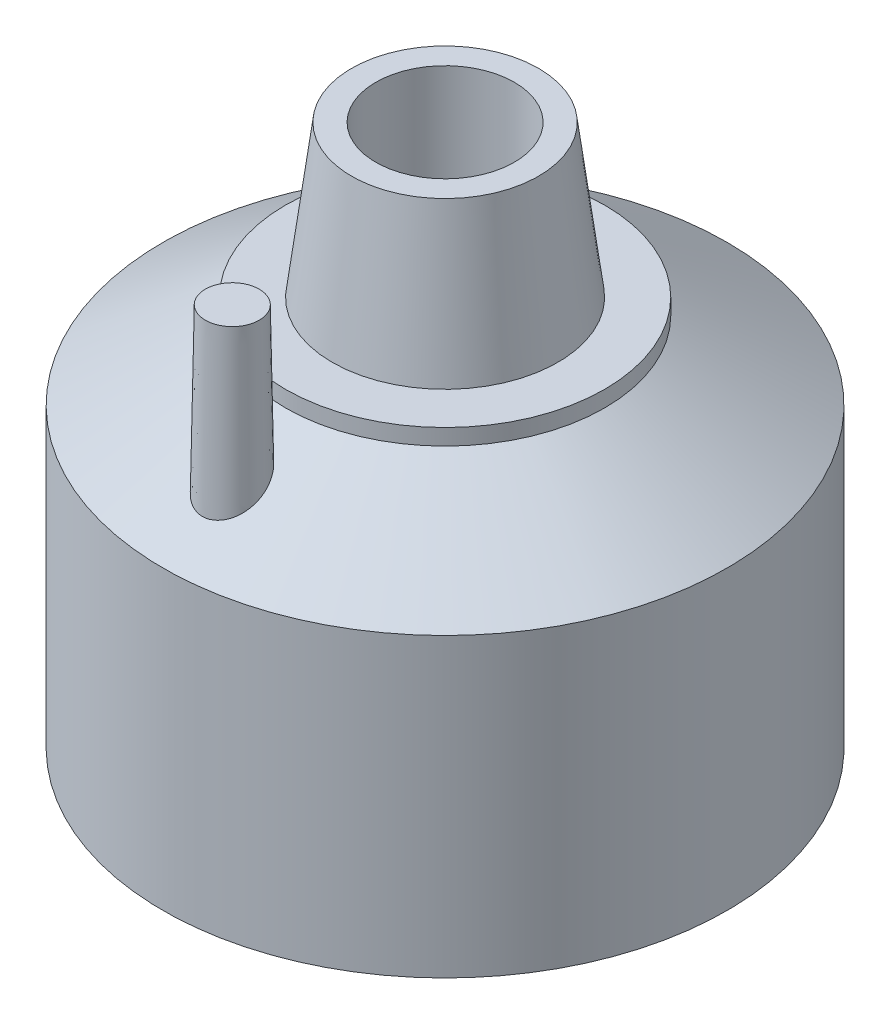
ISO-10303-21;
HEADER;
FILE_DESCRIPTION(('STEP AP214'),'2;1');
FILE_NAME('part.step','',(''),(''),'','','');
FILE_SCHEMA(('AUTOMOTIVE_DESIGN { 1 0 10303 214 1 1 1 1 }'));
ENDSEC;
DATA;
#1=APPLICATION_CONTEXT('core data for automotive mechanical design processes');
#2=APPLICATION_PROTOCOL_DEFINITION('international standard','automotive_design',2000,#1);
#3=PRODUCT_CONTEXT('',#1,'mechanical');
#4=PRODUCT('Part','Part','',(#3));
#5=PRODUCT_RELATED_PRODUCT_CATEGORY('part','',(#4));
#6=PRODUCT_DEFINITION_FORMATION('','',#4);
#7=PRODUCT_DEFINITION_CONTEXT('part definition',#1,'design');
#8=PRODUCT_DEFINITION('design','',#6,#7);
#9=PRODUCT_DEFINITION_SHAPE('','',#8);
#10=(LENGTH_UNIT() NAMED_UNIT(*) SI_UNIT(.MILLI.,.METRE.));
#11=(NAMED_UNIT(*) PLANE_ANGLE_UNIT() SI_UNIT($,.RADIAN.));
#12=(NAMED_UNIT(*) SI_UNIT($,.STERADIAN.) SOLID_ANGLE_UNIT());
#13=UNCERTAINTY_MEASURE_WITH_UNIT(LENGTH_MEASURE(1.E-05),#10,'distance_accuracy_value','');
#14=(GEOMETRIC_REPRESENTATION_CONTEXT(3) GLOBAL_UNCERTAINTY_ASSIGNED_CONTEXT((#13)) GLOBAL_UNIT_ASSIGNED_CONTEXT((#10,
#11,#12)) REPRESENTATION_CONTEXT('',''));
#15=CARTESIAN_POINT('',(0.,0.,0.));
#16=DIRECTION('',(0.,0.,1.));
#17=DIRECTION('',(1.,0.,0.));
#18=AXIS2_PLACEMENT_3D('',#15,#16,#17);
#19=CARTESIAN_POINT('',(0.,78.825159791117,99.9718));
#20=DIRECTION('',(0.,1.,0.));
#21=DIRECTION('',(0.,0.,1.));
#22=AXIS2_PLACEMENT_3D('',#19,#20,#21);
#23=PLANE('',#22);
#24=CARTESIAN_POINT('',(-28.5784036,78.825159791117,99.9718));
#25=DIRECTION('',(0.,-1.,0.));
#26=DIRECTION('',(0.,0.,-1.));
#27=AXIS2_PLACEMENT_3D('',#24,#25,#26);
#28=CIRCLE('',#27,5.461);
#29=CARTESIAN_POINT('',(-28.5784036,78.825159791117,94.5108));
#30=VERTEX_POINT('',#29);
#31=EDGE_CURVE('E35',#30,#30,#28,.T.);
#32=ORIENTED_EDGE('',*,*,#31,.F.);
#33=EDGE_LOOP('',(#32));
#34=FACE_BOUND('',#33,.T.);
#35=ADVANCED_FACE('F32',(#34),#23,.T.);
#36=CARTESIAN_POINT('',(-28.5784036,50.8,99.9718));
#37=DIRECTION('',(0.,-1.,0.));
#38=DIRECTION('',(0.,0.,-1.));
#39=AXIS2_PLACEMENT_3D('',#36,#37,#38);
#40=CYLINDRICAL_SURFACE('',#39,5.461);
#41=ORIENTED_EDGE('',*,*,#31,.T.);
#42=EDGE_LOOP('',(#41));
#43=FACE_BOUND('',#42,.T.);
#44=CARTESIAN_POINT('',(-28.5784036,93.472,99.9718));
#45=DIRECTION('',(0.,-1.,0.));
#46=DIRECTION('',(0.,0.,-1.));
#47=AXIS2_PLACEMENT_3D('',#44,#45,#46);
#48=CIRCLE('',#47,5.461);
#49=CARTESIAN_POINT('',(-28.5784036,93.472,94.5108));
#50=VERTEX_POINT('',#49);
#51=EDGE_CURVE('E43',#50,#50,#48,.T.);
#52=ORIENTED_EDGE('',*,*,#51,.F.);
#53=EDGE_LOOP('',(#52));
#54=FACE_BOUND('',#53,.T.);
#55=ADVANCED_FACE('F78',(#43,#54),#40,.F.);
#56=CARTESIAN_POINT('',(0.,93.472,99.9718));
#57=DIRECTION('',(0.,1.,0.));
#58=DIRECTION('',(0.,0.,1.));
#59=AXIS2_PLACEMENT_3D('',#56,#57,#58);
#60=PLANE('',#59);
#61=ORIENTED_EDGE('',*,*,#51,.T.);
#62=EDGE_LOOP('',(#61));
#63=FACE_BOUND('',#62,.T.);
#64=CARTESIAN_POINT('',(-28.5784036,93.472,99.9718));
#65=DIRECTION('',(0.,-1.,0.));
#66=DIRECTION('',(0.,0.,-1.));
#67=AXIS2_PLACEMENT_3D('',#64,#65,#66);
#68=CIRCLE('',#67,7.366);
#69=CARTESIAN_POINT('',(-28.5784036,93.472,92.6058));
#70=VERTEX_POINT('',#69);
#71=EDGE_CURVE('E90',#70,#70,#68,.T.);
#72=ORIENTED_EDGE('',*,*,#71,.F.);
#73=EDGE_LOOP('',(#72));
#74=FACE_BOUND('',#73,.T.);
#75=ADVANCED_FACE('F83',(#63,#74),#60,.T.);
#76=CARTESIAN_POINT('',(-28.5784036,81.534,99.9718));
#77=DIRECTION('',(0.,-1.,0.));
#78=DIRECTION('',(0.,0.,-1.));
#79=AXIS2_PLACEMENT_3D('',#76,#77,#78);
#80=CONICAL_SURFACE('',#79,8.89,0.126972789614079);
#81=ORIENTED_EDGE('',*,*,#71,.T.);
#82=EDGE_LOOP('',(#81));
#83=FACE_BOUND('',#82,.T.);
#84=CARTESIAN_POINT('',(-28.5784036,81.534,99.9718));
#85=DIRECTION('',(0.,-1.,0.));
#86=DIRECTION('',(0.,0.,-1.));
#87=AXIS2_PLACEMENT_3D('',#84,#85,#86);
#88=CIRCLE('',#87,8.89);
#89=CARTESIAN_POINT('',(-28.5784036,81.534,91.0818));
#90=VERTEX_POINT('',#89);
#91=EDGE_CURVE('E92',#90,#90,#88,.T.);
#92=ORIENTED_EDGE('',*,*,#91,.F.);
#93=EDGE_LOOP('',(#92));
#94=FACE_BOUND('',#93,.T.);
#95=ADVANCED_FACE('F153',(#83,#94),#80,.T.);
#96=CARTESIAN_POINT('',(0.,81.534,99.9718));
#97=DIRECTION('',(0.,1.,0.));
#98=DIRECTION('',(0.,0.,1.));
#99=AXIS2_PLACEMENT_3D('',#96,#97,#98);
#100=PLANE('',#99);
#101=ORIENTED_EDGE('',*,*,#91,.T.);
#102=EDGE_LOOP('',(#101));
#103=FACE_BOUND('',#102,.T.);
#104=CARTESIAN_POINT('',(-28.5784036,81.534,99.9718));
#105=DIRECTION('',(0.,-1.,0.));
#106=DIRECTION('',(0.,0.,-1.));
#107=AXIS2_PLACEMENT_3D('',#104,#105,#106);
#108=CIRCLE('',#107,12.573);
#109=CARTESIAN_POINT('',(-28.5784036,81.534,87.3988));
#110=VERTEX_POINT('',#109);
#111=EDGE_CURVE('E97',#110,#110,#108,.T.);
#112=ORIENTED_EDGE('',*,*,#111,.F.);
#113=EDGE_LOOP('',(#112));
#114=FACE_BOUND('',#113,.T.);
#115=ADVANCED_FACE('F144',(#103,#114),#100,.T.);
#116=CARTESIAN_POINT('',(-28.5784036,50.8,99.9718));
#117=DIRECTION('',(0.,-1.,0.));
#118=DIRECTION('',(0.,0.,-1.));
#119=AXIS2_PLACEMENT_3D('',#116,#117,#118);
#120=CYLINDRICAL_SURFACE('',#119,12.573);
#121=ORIENTED_EDGE('',*,*,#111,.T.);
#122=EDGE_LOOP('',(#121));
#123=FACE_BOUND('',#122,.T.);
#124=CARTESIAN_POINT('',(-28.5784036,80.264,99.9718));
#125=DIRECTION('',(0.,-1.,0.));
#126=DIRECTION('',(0.,0.,-1.));
#127=AXIS2_PLACEMENT_3D('',#124,#125,#126);
#128=CIRCLE('',#127,12.573);
#129=CARTESIAN_POINT('',(-28.5784036,80.264,87.3988));
#130=VERTEX_POINT('',#129);
#131=EDGE_CURVE('E100',#130,#130,#128,.T.);
#132=ORIENTED_EDGE('',*,*,#131,.F.);
#133=EDGE_LOOP('',(#132));
#134=FACE_BOUND('',#133,.T.);
#135=ADVANCED_FACE('F73',(#123,#134),#120,.T.);
#136=CARTESIAN_POINT('',(-28.5784036,74.168,99.9718));
#137=DIRECTION('',(0.,-1.,0.));
#138=DIRECTION('',(0.,0.,-1.));
#139=AXIS2_PLACEMENT_3D('',#136,#137,#138);
#140=CONICAL_SURFACE('',#139,22.225,1.00748006530293);
#141=CARTESIAN_POINT('',(-28.5784036,76.1316839078011,119.087633812648));
#142=CARTESIAN_POINT('',(-28.4598725241451,76.1316874812556,119.087626762919));
#143=CARTESIAN_POINT('',(-28.3412790382611,76.1367254457896,119.078538008571));
#144=CARTESIAN_POINT('',(-28.1076203111345,76.156669628104,119.042623828195));
#145=CARTESIAN_POINT('',(-27.992557972583,76.171583748389,119.015784198649));
#146=CARTESIAN_POINT('',(-27.7695411809564,76.2106029783678,118.945779304501));
#147=CARTESIAN_POINT('',(-27.6615684206248,76.2346832283066,118.902658199944));
#148=CARTESIAN_POINT('',(-27.4549727507176,76.2911289820328,118.801993866382));
#149=CARTESIAN_POINT('',(-27.3563502634549,76.3234948598033,118.744449986389));
#150=CARTESIAN_POINT('',(-27.1660121649743,76.3971235030331,118.614205143168));
#151=CARTESIAN_POINT('',(-27.0748258096746,76.438728094251,118.540926958957));
#152=CARTESIAN_POINT('',(-26.9060871547779,76.5286066391059,118.383605213992));
#153=CARTESIAN_POINT('',(-26.8285397191931,76.5768829611484,118.299557831044));
#154=CARTESIAN_POINT('',(-26.6795634897714,76.6849177029385,118.11278677307));
#155=CARTESIAN_POINT('',(-26.6099282846244,76.745358775465,118.00902919211));
#156=CARTESIAN_POINT('',(-26.4890636824099,76.8715390202204,117.794292404454));
#157=CARTESIAN_POINT('',(-26.437843894318,76.9372809365365,117.683309463206));
#158=CARTESIAN_POINT('',(-26.3481953878434,77.0817437725204,117.441707080642));
#159=CARTESIAN_POINT('',(-26.3123935830621,77.161024601495,117.310446575249));
#160=CARTESIAN_POINT('',(-26.2641228389832,77.3227856212742,117.045641148799));
#161=CARTESIAN_POINT('',(-26.2516646064119,77.4052672624643,116.912095207832));
#162=CARTESIAN_POINT('',(-26.249526226532,77.5810900504368,116.630757784817));
#163=CARTESIAN_POINT('',(-26.2625636351727,77.6746097809665,116.483052232635));
#164=CARTESIAN_POINT('',(-26.316424124744,77.8611695624058,116.192323809898));
#165=CARTESIAN_POINT('',(-26.3572700610067,77.9542091552739,116.049304892624));
#166=CARTESIAN_POINT('',(-26.4686859631252,78.1410260179588,115.765938362515));
#167=CARTESIAN_POINT('',(-26.5404488641205,78.2346656443574,115.625964554948));
#168=CARTESIAN_POINT('',(-26.7133739804517,78.4147626558587,115.360308952817));
#169=CARTESIAN_POINT('',(-26.8144933844636,78.5012302656715,115.234606714386));
#170=CARTESIAN_POINT('',(-27.0148574200582,78.6410025700411,115.033794032727));
#171=CARTESIAN_POINT('',(-27.1075899378043,78.6970456254275,114.954075933221));
#172=CARTESIAN_POINT('',(-27.3077268629972,78.8002400647957,114.808396540044));
#173=CARTESIAN_POINT('',(-27.4151237067548,78.8473960029971,114.742428198436));
#174=CARTESIAN_POINT('',(-27.6440244373105,78.9304133850622,114.62696771878));
#175=CARTESIAN_POINT('',(-27.7656450802323,78.966170860812,114.5776270252));
#176=CARTESIAN_POINT('',(-27.9551730126983,79.0086810415945,114.519178183047));
#177=CARTESIAN_POINT('',(-28.019537164374,79.0209972945254,114.502288218509));
#178=CARTESIAN_POINT('',(-28.1500752086875,79.041660554559,114.473991300139));
#179=CARTESIAN_POINT('',(-28.216248729165,79.0500083715112,114.462583227599));
#180=CARTESIAN_POINT('',(-28.3964401710037,79.0668591604202,114.439567938081));
#181=CARTESIAN_POINT('',(-28.5115997205809,79.0713997889046,114.433384634783));
#182=CARTESIAN_POINT('',(-28.7412854229851,79.067930441905,114.438116281923));
#183=CARTESIAN_POINT('',(-28.8558117910811,79.0599250335728,114.449025010324));
#184=CARTESIAN_POINT('',(-29.0720565174603,79.0330927394219,114.485712728619));
#185=CARTESIAN_POINT('',(-29.1740887732741,79.015129253199,114.510305808116));
#186=CARTESIAN_POINT('',(-29.3721006862263,78.9701531533675,114.572158665167));
#187=CARTESIAN_POINT('',(-29.4680793332206,78.9431390342339,114.609420550124));
#188=CARTESIAN_POINT('',(-29.6589093690721,78.8792119597103,114.698103703842));
#189=CARTESIAN_POINT('',(-29.7531812053461,78.8417259931794,114.750351774536));
#190=CARTESIAN_POINT('',(-29.9315148622799,78.7596721051291,114.865549326048));
#191=CARTESIAN_POINT('',(-30.0155716043152,78.715100686155,114.928504092881));
#192=CARTESIAN_POINT('',(-30.1855305920768,78.6127722730619,115.07420085012));
#193=CARTESIAN_POINT('',(-30.2695171146368,78.5540493835544,115.158495969387));
#194=CARTESIAN_POINT('',(-30.4222154624221,78.4312901423564,115.336493416496));
#195=CARTESIAN_POINT('',(-30.4909177886855,78.3672505201312,115.430201542207));
#196=CARTESIAN_POINT('',(-30.6238720321683,78.2236252325379,115.642565752159));
#197=CARTESIAN_POINT('',(-30.6850571427081,78.143326482694,115.76266421395));
#198=CARTESIAN_POINT('',(-30.7855347249847,77.9800201463776,116.009977216022));
#199=CARTESIAN_POINT('',(-30.8248137540297,77.89701092962,116.137196073175));
#200=CARTESIAN_POINT('',(-30.8848156201326,77.7194033022179,116.412760831353));
#201=CARTESIAN_POINT('',(-30.9024810259303,77.6246946894858,116.561710965601));
#202=CARTESIAN_POINT('',(-30.9088988213643,77.4367596832998,116.861243204119));
#203=CARTESIAN_POINT('',(-30.897639786906,77.3435338901369,117.011825929814));
#204=CARTESIAN_POINT('',(-30.8448286042189,77.1586201229321,117.314245287948));
#205=CARTESIAN_POINT('',(-30.802492753242,77.0670359480779,117.466011908177));
#206=CARTESIAN_POINT('',(-30.6861202771146,76.8908760687193,117.761312594969));
#207=CARTESIAN_POINT('',(-30.6120942700678,76.8062980280582,117.904849400764));
#208=CARTESIAN_POINT('',(-30.4397707602005,76.6538213053352,118.166197882018));
#209=CARTESIAN_POINT('',(-30.3439564237695,76.5851239940901,118.28515358318));
#210=CARTESIAN_POINT('',(-30.1815101699838,76.4907648792475,118.449771763176));
#211=CARTESIAN_POINT('',(-30.1242279056236,76.4607547513649,118.502350643964));
#212=CARTESIAN_POINT('',(-30.0037045351199,76.4039644025528,118.602191528957));
#213=CARTESIAN_POINT('',(-29.9404647403501,76.3771834737564,118.649454698257));
#214=CARTESIAN_POINT('',(-29.8180133960311,76.3308369608966,118.731489533548));
#215=CARTESIAN_POINT('',(-29.7595309824742,76.3107876221269,118.767080094758));
#216=CARTESIAN_POINT('',(-29.6389491647705,76.2735723570553,118.833286572748));
#217=CARTESIAN_POINT('',(-29.5768505037946,76.2564058411046,118.863903506785));
#218=CARTESIAN_POINT('',(-29.4496174345338,76.2251988675184,118.919660855169));
#219=CARTESIAN_POINT('',(-29.3844885098468,76.2111530098922,118.94481072807));
#220=CARTESIAN_POINT('',(-29.2516990126618,76.1863462198146,118.989288945318));
#221=CARTESIAN_POINT('',(-29.1840394019399,76.1755840533683,119.008619476509));
#222=CARTESIAN_POINT('',(-29.0280078198335,76.1550210291337,119.045587302045));
#223=CARTESIAN_POINT('',(-28.9390307988947,76.1462875729379,119.061316515146));
#224=CARTESIAN_POINT('',(-28.7595157113794,76.1346180736803,119.082341695999));
#225=CARTESIAN_POINT('',(-28.6689778765838,76.1316811771834,119.087639199625));
#226=CARTESIAN_POINT('',(-28.5784036,76.1316839078011,119.087633812648));
#227=B_SPLINE_CURVE_WITH_KNOTS('',3,(#141,#142,#143,#144,#145,#146,#147,#148,#149,#150,#151,
#152,#153,#154,#155,#156,#157,#158,#159,#160,#161,#162,#163,#164,#165,#166,#167,#168,#169,#170,
#171,#172,#173,#174,#175,#176,#177,#178,#179,#180,#181,#182,#183,#184,#185,#186,#187,#188,#189,
#190,#191,#192,#193,#194,#195,#196,#197,#198,#199,#200,#201,#202,#203,#204,#205,#206,#207,#208,
#209,#210,#211,#212,#213,#214,#215,#216,#217,#218,#219,#220,#221,#222,#223,#224,#225,#226),
.UNSPECIFIED.,.T.,.F.,(4,2,2,2,2,2,2,2,2,2,2,2,2,2,2,2,2,2,2,2,2,2,2,2,2,2,2,2,2,2,2,2,2,2,2,2,
2,2,2,2,2,2,4),(0.,0.355256284328102,0.710797174553025,1.06538058320486,1.41997999928794,
1.7909542587963,2.16206055079821,2.5768329186451,2.99182139743039,3.46231198550514,
3.9330183152802,4.45663028545393,4.98067312329707,5.52705650179108,6.07264704424735,
6.47463195081882,6.87641029599184,7.28175492770034,7.48445915983726,7.6871220078003,
8.03130611216698,8.37536495180019,8.69342603719086,9.01154005665315,9.3525760848454,
9.69378097776549,10.0903779806459,10.4872207799304,10.9560344676509,11.4251355277631,
11.9549147086646,12.4849031651068,13.0287372063179,13.5723891729373,14.0715340688673,
14.3212018413227,14.570814784667,14.78452109608,14.9981836428903,15.2114735372955,
15.4246831794084,15.6961885145979,15.9676538727141),.UNSPECIFIED.);
#228=CARTESIAN_POINT('',(-28.5784036,76.1316839078011,119.087633812648));
#229=VERTEX_POINT('',#228);
#230=EDGE_CURVE('E10',#229,#229,#227,.T.);
#231=ORIENTED_EDGE('',*,*,#230,.F.);
#232=EDGE_LOOP('',(#231));
#233=FACE_BOUND('',#232,.T.);
#234=ORIENTED_EDGE('',*,*,#131,.T.);
#235=EDGE_LOOP('',(#234));
#236=FACE_BOUND('',#235,.T.);
#237=CARTESIAN_POINT('',(-28.5784036,74.168,99.9718));
#238=DIRECTION('',(0.,-1.,0.));
#239=DIRECTION('',(0.,0.,-1.));
#240=AXIS2_PLACEMENT_3D('',#237,#238,#239);
#241=CIRCLE('',#240,22.225);
#242=CARTESIAN_POINT('',(-28.5784036,74.168,77.7468));
#243=VERTEX_POINT('',#242);
#244=EDGE_CURVE('E102',#243,#243,#241,.T.);
#245=ORIENTED_EDGE('',*,*,#244,.F.);
#246=EDGE_LOOP('',(#245));
#247=FACE_BOUND('',#246,.T.);
#248=ADVANCED_FACE('F54',(#233,#236,#247),#140,.T.);
#249=CARTESIAN_POINT('',(-28.5784036,50.8,99.9718));
#250=DIRECTION('',(0.,-1.,0.));
#251=DIRECTION('',(0.,0.,-1.));
#252=AXIS2_PLACEMENT_3D('',#249,#250,#251);
#253=CYLINDRICAL_SURFACE('',#252,22.225);
#254=ORIENTED_EDGE('',*,*,#244,.T.);
#255=EDGE_LOOP('',(#254));
#256=FACE_BOUND('',#255,.T.);
#257=CARTESIAN_POINT('',(-28.5784036,50.8,99.9718));
#258=DIRECTION('',(0.,-1.,0.));
#259=DIRECTION('',(0.,0.,-1.));
#260=AXIS2_PLACEMENT_3D('',#257,#258,#259);
#261=CIRCLE('',#260,22.225);
#262=CARTESIAN_POINT('',(-28.5784036,50.8,77.7468));
#263=VERTEX_POINT('',#262);
#264=EDGE_CURVE('E52',#263,#263,#261,.T.);
#265=ORIENTED_EDGE('',*,*,#264,.F.);
#266=EDGE_LOOP('',(#265));
#267=FACE_BOUND('',#266,.T.);
#268=ADVANCED_FACE('F66',(#256,#267),#253,.T.);
#269=CARTESIAN_POINT('',(0.,50.8,99.9718));
#270=DIRECTION('',(0.,-1.,0.));
#271=DIRECTION('',(0.,0.,-1.));
#272=AXIS2_PLACEMENT_3D('',#269,#270,#271);
#273=PLANE('',#272);
#274=ORIENTED_EDGE('',*,*,#264,.T.);
#275=EDGE_LOOP('',(#274));
#276=FACE_BOUND('',#275,.T.);
#277=ADVANCED_FACE('F64',(#276),#273,.T.);
#278=CARTESIAN_POINT('',(-28.5784036,50.8,116.7358));
#279=DIRECTION('',(0.,-1.,0.));
#280=DIRECTION('',(0.,0.,-1.));
#281=AXIS2_PLACEMENT_3D('',#278,#279,#280);
#282=CONICAL_SURFACE('',#281,2.79399999999999,0.0174532925199433);
#283=ORIENTED_EDGE('',*,*,#230,.T.);
#284=EDGE_LOOP('',(#283));
#285=FACE_BOUND('',#284,.T.);
#286=CARTESIAN_POINT('',(-28.5784036,89.408,116.7358));
#287=DIRECTION('',(0.,-1.,0.));
#288=DIRECTION('',(0.,0.,-1.));
#289=AXIS2_PLACEMENT_3D('',#286,#287,#288);
#290=CIRCLE('',#289,2.12009485325137);
#291=CARTESIAN_POINT('',(-28.5784036,89.408,114.615705146749));
#292=VERTEX_POINT('',#291);
#293=EDGE_CURVE('E51',#292,#292,#290,.T.);
#294=ORIENTED_EDGE('',*,*,#293,.T.);
#295=EDGE_LOOP('',(#294));
#296=FACE_BOUND('',#295,.T.);
#297=ADVANCED_FACE('F58',(#285,#296),#282,.T.);
#298=CARTESIAN_POINT('',(-28.5784036,89.408,116.7358));
#299=DIRECTION('',(0.,-1.,0.));
#300=DIRECTION('',(0.,0.,-1.));
#301=AXIS2_PLACEMENT_3D('',#298,#299,#300);
#302=PLANE('',#301);
#303=ORIENTED_EDGE('',*,*,#293,.F.);
#304=EDGE_LOOP('',(#303));
#305=FACE_BOUND('',#304,.T.);
#306=ADVANCED_FACE('F63',(#305),#302,.F.);
#307=CLOSED_SHELL('',(#35,#55,#75,#95,#115,#135,#248,#268,#277,#297,#306));
#308=MANIFOLD_SOLID_BREP('B2',#307);
#309=ADVANCED_BREP_SHAPE_REPRESENTATION('',(#18,#308),#14);
#310=SHAPE_DEFINITION_REPRESENTATION(#9,#309);
ENDSEC;
END-ISO-10303-21;
